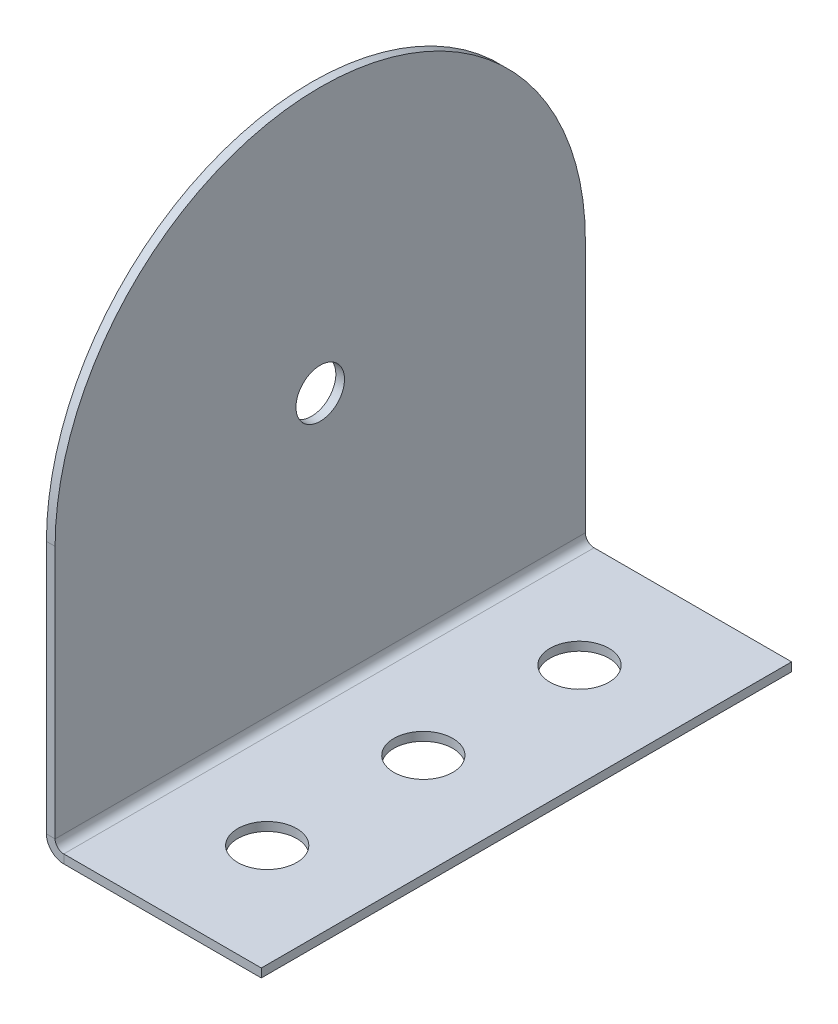
ISO-10303-21;
HEADER;
FILE_DESCRIPTION(('STEP AP214'),'2;1');
FILE_NAME('part.step','',(''),(''),'','','');
FILE_SCHEMA(('AUTOMOTIVE_DESIGN { 1 0 10303 214 1 1 1 1 }'));
ENDSEC;
DATA;
#1=APPLICATION_CONTEXT('core data for automotive mechanical design processes');
#2=APPLICATION_PROTOCOL_DEFINITION('international standard','automotive_design',2000,#1);
#3=PRODUCT_CONTEXT('',#1,'mechanical');
#4=PRODUCT('Part','Part','',(#3));
#5=PRODUCT_RELATED_PRODUCT_CATEGORY('part','',(#4));
#6=PRODUCT_DEFINITION_FORMATION('','',#4);
#7=PRODUCT_DEFINITION_CONTEXT('part definition',#1,'design');
#8=PRODUCT_DEFINITION('design','',#6,#7);
#9=PRODUCT_DEFINITION_SHAPE('','',#8);
#10=(LENGTH_UNIT() NAMED_UNIT(*) SI_UNIT(.MILLI.,.METRE.));
#11=(NAMED_UNIT(*) PLANE_ANGLE_UNIT() SI_UNIT($,.RADIAN.));
#12=(NAMED_UNIT(*) SI_UNIT($,.STERADIAN.) SOLID_ANGLE_UNIT());
#13=UNCERTAINTY_MEASURE_WITH_UNIT(LENGTH_MEASURE(1.E-05),#10,'distance_accuracy_value','');
#14=(GEOMETRIC_REPRESENTATION_CONTEXT(3) GLOBAL_UNCERTAINTY_ASSIGNED_CONTEXT((#13)) GLOBAL_UNIT_ASSIGNED_CONTEXT((#10,
#11,#12)) REPRESENTATION_CONTEXT('',''));
#15=CARTESIAN_POINT('',(0.,0.,0.));
#16=DIRECTION('',(0.,0.,1.));
#17=DIRECTION('',(1.,0.,0.));
#18=AXIS2_PLACEMENT_3D('',#15,#16,#17);
#19=CARTESIAN_POINT('',(1.76340000000008,22.2376271385243,22.5));
#20=DIRECTION('',(0.,0.,1.));
#21=DIRECTION('',(0.,-1.,0.));
#22=AXIS2_PLACEMENT_3D('',#19,#20,#21);
#23=PLANE('',#22);
#24=DIRECTION('',(0.,-1.,0.));
#25=VECTOR('',#24,1.);
#26=CARTESIAN_POINT('',(1.76340000000008,22.2376271385243,22.5));
#27=LINE('',#26,#25);
#28=CARTESIAN_POINT('',(1.76340000000008,22.2376271385243,22.5));
#29=VERTEX_POINT('',#28);
#30=CARTESIAN_POINT('',(1.7634,0.736600000000005,22.5));
#31=VERTEX_POINT('',#30);
#32=EDGE_CURVE('E101',#29,#31,#27,.T.);
#33=ORIENTED_EDGE('',*,*,#32,.T.);
#34=DIRECTION('',(1.,0.,0.));
#35=VECTOR('',#34,1.);
#36=CARTESIAN_POINT('',(1.7634,0.736600000000005,22.5));
#37=LINE('',#36,#35);
#38=CARTESIAN_POINT('',(2.5,0.736600000000004,22.5));
#39=VERTEX_POINT('',#38);
#40=EDGE_CURVE('E12',#31,#39,#37,.T.);
#41=ORIENTED_EDGE('',*,*,#40,.T.);
#42=DIRECTION('',(0.,-1.,0.));
#43=VECTOR('',#42,1.);
#44=CARTESIAN_POINT('',(2.50000000000008,22.2376271385243,22.5));
#45=LINE('',#44,#43);
#46=CARTESIAN_POINT('',(2.50000000000008,22.2376271385243,22.5));
#47=VERTEX_POINT('',#46);
#48=EDGE_CURVE('E94',#47,#39,#45,.T.);
#49=ORIENTED_EDGE('',*,*,#48,.F.);
#50=DIRECTION('',(1.,0.,0.));
#51=VECTOR('',#50,1.);
#52=CARTESIAN_POINT('',(1.76340000000008,22.2376271385243,22.5));
#53=LINE('',#52,#51);
#54=EDGE_CURVE('E66',#29,#47,#53,.T.);
#55=ORIENTED_EDGE('',*,*,#54,.F.);
#56=EDGE_LOOP('',(#33,#41,#49,#55));
#57=FACE_BOUND('',#56,.T.);
#58=ADVANCED_FACE('F41',(#57),#23,.T.);
#59=CARTESIAN_POINT('',(1.76340000000007,22.2376271385243,-22.5));
#60=DIRECTION('',(0.,0.,-1.));
#61=DIRECTION('',(0.,1.,0.));
#62=AXIS2_PLACEMENT_3D('',#59,#60,#61);
#63=PLANE('',#62);
#64=DIRECTION('',(0.,1.,0.));
#65=VECTOR('',#64,1.);
#66=CARTESIAN_POINT('',(2.50000000000007,22.2376271385243,-22.5));
#67=LINE('',#66,#65);
#68=CARTESIAN_POINT('',(2.5,0.736600000000004,-22.4999999999999));
#69=VERTEX_POINT('',#68);
#70=CARTESIAN_POINT('',(2.50000000000007,22.2376271385243,-22.5));
#71=VERTEX_POINT('',#70);
#72=EDGE_CURVE('E96',#69,#71,#67,.T.);
#73=ORIENTED_EDGE('',*,*,#72,.F.);
#74=DIRECTION('',(-1.,0.,0.));
#75=VECTOR('',#74,1.);
#76=CARTESIAN_POINT('',(1.7634,0.736600000000005,-22.5));
#77=LINE('',#76,#75);
#78=CARTESIAN_POINT('',(1.7634,0.736600000000008,-22.5));
#79=VERTEX_POINT('',#78);
#80=EDGE_CURVE('E119',#69,#79,#77,.T.);
#81=ORIENTED_EDGE('',*,*,#80,.T.);
#82=DIRECTION('',(0.,1.,0.));
#83=VECTOR('',#82,1.);
#84=CARTESIAN_POINT('',(1.76340000000007,22.2376271385243,-22.5));
#85=LINE('',#84,#83);
#86=CARTESIAN_POINT('',(1.76340000000007,22.2376271385243,-22.5));
#87=VERTEX_POINT('',#86);
#88=EDGE_CURVE('E44',#79,#87,#85,.T.);
#89=ORIENTED_EDGE('',*,*,#88,.T.);
#90=DIRECTION('',(1.,0.,0.));
#91=VECTOR('',#90,1.);
#92=CARTESIAN_POINT('',(1.76340000000007,22.2376271385243,-22.5));
#93=LINE('',#92,#91);
#94=EDGE_CURVE('E86',#87,#71,#93,.T.);
#95=ORIENTED_EDGE('',*,*,#94,.T.);
#96=EDGE_LOOP('',(#73,#81,#89,#95));
#97=FACE_BOUND('',#96,.T.);
#98=ADVANCED_FACE('F234',(#97),#63,.T.);
#99=CARTESIAN_POINT('',(1.76340000000008,22.2376271385243,0.));
#100=DIRECTION('',(-1.,0.,0.));
#101=DIRECTION('',(0.,0.,-1.));
#102=AXIS2_PLACEMENT_3D('',#99,#100,#101);
#103=PLANE('',#102);
#104=CARTESIAN_POINT('',(1.76340000000008,22.2376271385243,0.));
#105=DIRECTION('',(1.,0.,0.));
#106=DIRECTION('',(0.,0.,1.));
#107=AXIS2_PLACEMENT_3D('',#104,#105,#106);
#108=CIRCLE('',#107,2.06);
#109=CARTESIAN_POINT('',(1.76340000000008,22.2376271385243,2.06));
#110=VERTEX_POINT('',#109);
#111=EDGE_CURVE('E102',#110,#110,#108,.T.);
#112=ORIENTED_EDGE('',*,*,#111,.T.);
#113=EDGE_LOOP('',(#112));
#114=FACE_BOUND('',#113,.T.);
#115=ORIENTED_EDGE('',*,*,#88,.F.);
#116=DIRECTION('',(0.,0.,1.));
#117=VECTOR('',#116,1.);
#118=CARTESIAN_POINT('',(1.7634,0.736600000000005,0.));
#119=LINE('',#118,#117);
#120=EDGE_CURVE('E85',#79,#31,#119,.T.);
#121=ORIENTED_EDGE('',*,*,#120,.T.);
#122=ORIENTED_EDGE('',*,*,#32,.F.);
#123=CARTESIAN_POINT('',(1.76340000000008,22.2376271385243,0.));
#124=DIRECTION('',(1.,0.,0.));
#125=DIRECTION('',(0.,0.,-1.));
#126=AXIS2_PLACEMENT_3D('',#123,#124,#125);
#127=CIRCLE('',#126,22.5);
#128=EDGE_CURVE('E83',#87,#29,#127,.T.);
#129=ORIENTED_EDGE('',*,*,#128,.F.);
#130=EDGE_LOOP('',(#115,#121,#122,#129));
#131=FACE_BOUND('',#130,.T.);
#132=ADVANCED_FACE('F232',(#114,#131),#103,.T.);
#133=CARTESIAN_POINT('',(1.76340000000008,22.2376271385243,0.));
#134=DIRECTION('',(1.,0.,0.));
#135=DIRECTION('',(0.,0.,1.));
#136=AXIS2_PLACEMENT_3D('',#133,#134,#135);
#137=CYLINDRICAL_SURFACE('',#136,22.5);
#138=CARTESIAN_POINT('',(2.50000000000008,22.2376271385243,0.));
#139=DIRECTION('',(1.,0.,0.));
#140=DIRECTION('',(0.,0.,-1.));
#141=AXIS2_PLACEMENT_3D('',#138,#139,#140);
#142=CIRCLE('',#141,22.5);
#143=EDGE_CURVE('E81',#71,#47,#142,.T.);
#144=ORIENTED_EDGE('',*,*,#143,.F.);
#145=ORIENTED_EDGE('',*,*,#94,.F.);
#146=ORIENTED_EDGE('',*,*,#128,.T.);
#147=ORIENTED_EDGE('',*,*,#54,.T.);
#148=EDGE_LOOP('',(#144,#145,#146,#147));
#149=FACE_BOUND('',#148,.T.);
#150=ADVANCED_FACE('F79',(#149),#137,.T.);
#151=CARTESIAN_POINT('',(2.50000000000008,22.2376271385243,0.));
#152=DIRECTION('',(-1.,0.,0.));
#153=DIRECTION('',(0.,0.,-1.));
#154=AXIS2_PLACEMENT_3D('',#151,#152,#153);
#155=PLANE('',#154);
#156=DIRECTION('',(0.,0.,1.));
#157=VECTOR('',#156,1.);
#158=CARTESIAN_POINT('',(2.5,0.736600000000003,0.));
#159=LINE('',#158,#157);
#160=EDGE_CURVE('E49',#69,#39,#159,.T.);
#161=ORIENTED_EDGE('',*,*,#160,.F.);
#162=ORIENTED_EDGE('',*,*,#72,.T.);
#163=ORIENTED_EDGE('',*,*,#143,.T.);
#164=ORIENTED_EDGE('',*,*,#48,.T.);
#165=EDGE_LOOP('',(#161,#162,#163,#164));
#166=FACE_BOUND('',#165,.T.);
#167=CARTESIAN_POINT('',(2.50000000000008,22.2376271385243,0.));
#168=DIRECTION('',(1.,0.,0.));
#169=DIRECTION('',(0.,0.,1.));
#170=AXIS2_PLACEMENT_3D('',#167,#168,#169);
#171=CIRCLE('',#170,2.06);
#172=CARTESIAN_POINT('',(2.50000000000008,22.2376271385243,2.06));
#173=VERTEX_POINT('',#172);
#174=EDGE_CURVE('E104',#173,#173,#171,.T.);
#175=ORIENTED_EDGE('',*,*,#174,.F.);
#176=EDGE_LOOP('',(#175));
#177=FACE_BOUND('',#176,.T.);
#178=ADVANCED_FACE('F91',(#166,#177),#155,.F.);
#179=CARTESIAN_POINT('',(1.76340000000008,22.2376271385243,0.));
#180=DIRECTION('',(1.,0.,0.));
#181=DIRECTION('',(0.,0.,1.));
#182=AXIS2_PLACEMENT_3D('',#179,#180,#181);
#183=CYLINDRICAL_SURFACE('',#182,2.06);
#184=ORIENTED_EDGE('',*,*,#111,.F.);
#185=EDGE_LOOP('',(#184));
#186=FACE_BOUND('',#185,.T.);
#187=ORIENTED_EDGE('',*,*,#174,.T.);
#188=EDGE_LOOP('',(#187));
#189=FACE_BOUND('',#188,.T.);
#190=ADVANCED_FACE('F244',(#186,#189),#183,.F.);
#191=CARTESIAN_POINT('',(11.25,-0.7366,13.25));
#192=DIRECTION('',(0.,1.,0.));
#193=DIRECTION('',(0.,0.,1.));
#194=AXIS2_PLACEMENT_3D('',#191,#192,#193);
#195=CYLINDRICAL_SURFACE('',#194,2.5);
#196=CARTESIAN_POINT('',(11.25,-0.7366,13.25));
#197=DIRECTION('',(0.,1.,0.));
#198=DIRECTION('',(0.,0.,1.));
#199=AXIS2_PLACEMENT_3D('',#196,#197,#198);
#200=CIRCLE('',#199,2.5);
#201=CARTESIAN_POINT('',(11.25,-0.7366,15.75));
#202=VERTEX_POINT('',#201);
#203=EDGE_CURVE('E167',#202,#202,#200,.T.);
#204=ORIENTED_EDGE('',*,*,#203,.F.);
#205=EDGE_LOOP('',(#204));
#206=FACE_BOUND('',#205,.T.);
#207=CARTESIAN_POINT('',(11.25,0.,13.25));
#208=DIRECTION('',(0.,1.,0.));
#209=DIRECTION('',(0.,0.,1.));
#210=AXIS2_PLACEMENT_3D('',#207,#208,#209);
#211=CIRCLE('',#210,2.5);
#212=CARTESIAN_POINT('',(11.25,0.,15.75));
#213=VERTEX_POINT('',#212);
#214=EDGE_CURVE('E188',#213,#213,#211,.T.);
#215=ORIENTED_EDGE('',*,*,#214,.T.);
#216=EDGE_LOOP('',(#215));
#217=FACE_BOUND('',#216,.T.);
#218=ADVANCED_FACE('F249',(#206,#217),#195,.F.);
#219=CARTESIAN_POINT('',(11.25,-0.7366,-13.25));
#220=DIRECTION('',(0.,1.,0.));
#221=DIRECTION('',(0.,0.,1.));
#222=AXIS2_PLACEMENT_3D('',#219,#220,#221);
#223=CYLINDRICAL_SURFACE('',#222,2.5);
#224=CARTESIAN_POINT('',(11.25,-0.7366,-13.25));
#225=DIRECTION('',(0.,1.,0.));
#226=DIRECTION('',(0.,0.,1.));
#227=AXIS2_PLACEMENT_3D('',#224,#225,#226);
#228=CIRCLE('',#227,2.5);
#229=CARTESIAN_POINT('',(11.25,-0.7366,-10.75));
#230=VERTEX_POINT('',#229);
#231=EDGE_CURVE('E170',#230,#230,#228,.T.);
#232=ORIENTED_EDGE('',*,*,#231,.F.);
#233=EDGE_LOOP('',(#232));
#234=FACE_BOUND('',#233,.T.);
#235=CARTESIAN_POINT('',(11.25,0.,-13.25));
#236=DIRECTION('',(0.,1.,0.));
#237=DIRECTION('',(0.,0.,1.));
#238=AXIS2_PLACEMENT_3D('',#235,#236,#237);
#239=CIRCLE('',#238,2.5);
#240=CARTESIAN_POINT('',(11.25,0.,-10.75));
#241=VERTEX_POINT('',#240);
#242=EDGE_CURVE('E185',#241,#241,#239,.T.);
#243=ORIENTED_EDGE('',*,*,#242,.T.);
#244=EDGE_LOOP('',(#243));
#245=FACE_BOUND('',#244,.T.);
#246=ADVANCED_FACE('F272',(#234,#245),#223,.F.);
#247=CARTESIAN_POINT('',(11.25,-0.7366,0.));
#248=DIRECTION('',(0.,1.,0.));
#249=DIRECTION('',(0.,0.,1.));
#250=AXIS2_PLACEMENT_3D('',#247,#248,#249);
#251=CYLINDRICAL_SURFACE('',#250,2.50000000000001);
#252=CARTESIAN_POINT('',(11.25,-0.7366,0.));
#253=DIRECTION('',(0.,1.,0.));
#254=DIRECTION('',(0.,0.,1.));
#255=AXIS2_PLACEMENT_3D('',#252,#253,#254);
#256=CIRCLE('',#255,2.50000000000001);
#257=CARTESIAN_POINT('',(11.25,-0.7366,2.50000000000001));
#258=VERTEX_POINT('',#257);
#259=EDGE_CURVE('E173',#258,#258,#256,.T.);
#260=ORIENTED_EDGE('',*,*,#259,.F.);
#261=EDGE_LOOP('',(#260));
#262=FACE_BOUND('',#261,.T.);
#263=CARTESIAN_POINT('',(11.25,0.,0.));
#264=DIRECTION('',(0.,1.,0.));
#265=DIRECTION('',(0.,0.,1.));
#266=AXIS2_PLACEMENT_3D('',#263,#264,#265);
#267=CIRCLE('',#266,2.50000000000001);
#268=CARTESIAN_POINT('',(11.25,0.,2.50000000000001));
#269=VERTEX_POINT('',#268);
#270=EDGE_CURVE('E182',#269,#269,#267,.T.);
#271=ORIENTED_EDGE('',*,*,#270,.T.);
#272=EDGE_LOOP('',(#271));
#273=FACE_BOUND('',#272,.T.);
#274=ADVANCED_FACE('F268',(#262,#273),#251,.F.);
#275=CARTESIAN_POINT('',(20.,-0.7366,-22.5));
#276=DIRECTION('',(1.,0.,0.));
#277=DIRECTION('',(0.,0.,-1.));
#278=AXIS2_PLACEMENT_3D('',#275,#276,#277);
#279=PLANE('',#278);
#280=DIRECTION('',(0.,0.,-1.));
#281=VECTOR('',#280,1.);
#282=CARTESIAN_POINT('',(20.,0.,-22.5));
#283=LINE('',#282,#281);
#284=CARTESIAN_POINT('',(20.,0.,22.5));
#285=VERTEX_POINT('',#284);
#286=CARTESIAN_POINT('',(20.,0.,-22.5));
#287=VERTEX_POINT('',#286);
#288=EDGE_CURVE('E152',#285,#287,#283,.T.);
#289=ORIENTED_EDGE('',*,*,#288,.F.);
#290=DIRECTION('',(0.,1.,0.));
#291=VECTOR('',#290,1.);
#292=CARTESIAN_POINT('',(20.,-0.7366,22.5));
#293=LINE('',#292,#291);
#294=CARTESIAN_POINT('',(20.,-0.7366,22.5));
#295=VERTEX_POINT('',#294);
#296=EDGE_CURVE('E109',#295,#285,#293,.T.);
#297=ORIENTED_EDGE('',*,*,#296,.F.);
#298=DIRECTION('',(0.,0.,-1.));
#299=VECTOR('',#298,1.);
#300=CARTESIAN_POINT('',(20.,-0.7366,-22.5));
#301=LINE('',#300,#299);
#302=CARTESIAN_POINT('',(20.,-0.7366,-22.5));
#303=VERTEX_POINT('',#302);
#304=EDGE_CURVE('E179',#295,#303,#301,.T.);
#305=ORIENTED_EDGE('',*,*,#304,.T.);
#306=DIRECTION('',(0.,1.,0.));
#307=VECTOR('',#306,1.);
#308=CARTESIAN_POINT('',(20.,-0.7366,-22.5));
#309=LINE('',#308,#307);
#310=EDGE_CURVE('E176',#303,#287,#309,.T.);
#311=ORIENTED_EDGE('',*,*,#310,.T.);
#312=EDGE_LOOP('',(#289,#297,#305,#311));
#313=FACE_BOUND('',#312,.T.);
#314=ADVANCED_FACE('F265',(#313),#279,.T.);
#315=CARTESIAN_POINT('',(-20.,-0.7366,0.));
#316=DIRECTION('',(0.,-1.,0.));
#317=DIRECTION('',(0.,0.,-1.));
#318=AXIS2_PLACEMENT_3D('',#315,#316,#317);
#319=PLANE('',#318);
#320=DIRECTION('',(0.,0.,1.));
#321=VECTOR('',#320,1.);
#322=CARTESIAN_POINT('',(3.2366,-0.7366,0.));
#323=LINE('',#322,#321);
#324=CARTESIAN_POINT('',(3.2366,-0.7366,-22.5));
#325=VERTEX_POINT('',#324);
#326=CARTESIAN_POINT('',(3.2366,-0.7366,22.5));
#327=VERTEX_POINT('',#326);
#328=EDGE_CURVE('E112',#325,#327,#323,.T.);
#329=ORIENTED_EDGE('',*,*,#328,.F.);
#330=DIRECTION('',(-1.,0.,0.));
#331=VECTOR('',#330,1.);
#332=CARTESIAN_POINT('',(-20.,-0.7366,-22.5));
#333=LINE('',#332,#331);
#334=EDGE_CURVE('E164',#303,#325,#333,.T.);
#335=ORIENTED_EDGE('',*,*,#334,.F.);
#336=ORIENTED_EDGE('',*,*,#304,.F.);
#337=DIRECTION('',(1.,0.,0.));
#338=VECTOR('',#337,1.);
#339=CARTESIAN_POINT('',(-20.,-0.7366,22.5));
#340=LINE('',#339,#338);
#341=EDGE_CURVE('E149',#327,#295,#340,.T.);
#342=ORIENTED_EDGE('',*,*,#341,.F.);
#343=EDGE_LOOP('',(#329,#335,#336,#342));
#344=FACE_BOUND('',#343,.T.);
#345=ORIENTED_EDGE('',*,*,#259,.T.);
#346=EDGE_LOOP('',(#345));
#347=FACE_BOUND('',#346,.T.);
#348=ORIENTED_EDGE('',*,*,#231,.T.);
#349=EDGE_LOOP('',(#348));
#350=FACE_BOUND('',#349,.T.);
#351=ORIENTED_EDGE('',*,*,#203,.T.);
#352=EDGE_LOOP('',(#351));
#353=FACE_BOUND('',#352,.T.);
#354=ADVANCED_FACE('F201',(#344,#347,#350,#353),#319,.T.);
#355=CARTESIAN_POINT('',(-20.,-0.7366,-22.5));
#356=DIRECTION('',(0.,0.,-1.));
#357=DIRECTION('',(-1.,0.,0.));
#358=AXIS2_PLACEMENT_3D('',#355,#356,#357);
#359=PLANE('',#358);
#360=DIRECTION('',(0.,-1.,0.));
#361=VECTOR('',#360,1.);
#362=CARTESIAN_POINT('',(3.2366,-0.7366,-22.5));
#363=LINE('',#362,#361);
#364=CARTESIAN_POINT('',(3.2366,0.,-22.5));
#365=VERTEX_POINT('',#364);
#366=EDGE_CURVE('E191',#365,#325,#363,.T.);
#367=ORIENTED_EDGE('',*,*,#366,.F.);
#368=DIRECTION('',(-1.,0.,0.));
#369=VECTOR('',#368,1.);
#370=CARTESIAN_POINT('',(-20.,0.,-22.5));
#371=LINE('',#370,#369);
#372=EDGE_CURVE('E161',#287,#365,#371,.T.);
#373=ORIENTED_EDGE('',*,*,#372,.F.);
#374=ORIENTED_EDGE('',*,*,#310,.F.);
#375=ORIENTED_EDGE('',*,*,#334,.T.);
#376=EDGE_LOOP('',(#367,#373,#374,#375));
#377=FACE_BOUND('',#376,.T.);
#378=ADVANCED_FACE('F215',(#377),#359,.T.);
#379=CARTESIAN_POINT('',(-20.,0.,0.));
#380=DIRECTION('',(0.,-1.,0.));
#381=DIRECTION('',(0.,0.,-1.));
#382=AXIS2_PLACEMENT_3D('',#379,#380,#381);
#383=PLANE('',#382);
#384=ORIENTED_EDGE('',*,*,#214,.F.);
#385=EDGE_LOOP('',(#384));
#386=FACE_BOUND('',#385,.T.);
#387=ORIENTED_EDGE('',*,*,#242,.F.);
#388=EDGE_LOOP('',(#387));
#389=FACE_BOUND('',#388,.T.);
#390=ORIENTED_EDGE('',*,*,#270,.F.);
#391=EDGE_LOOP('',(#390));
#392=FACE_BOUND('',#391,.T.);
#393=ORIENTED_EDGE('',*,*,#372,.T.);
#394=DIRECTION('',(0.,0.,1.));
#395=VECTOR('',#394,1.);
#396=CARTESIAN_POINT('',(3.2366,0.,0.));
#397=LINE('',#396,#395);
#398=CARTESIAN_POINT('',(3.2366,0.,22.5));
#399=VERTEX_POINT('',#398);
#400=EDGE_CURVE('E158',#365,#399,#397,.T.);
#401=ORIENTED_EDGE('',*,*,#400,.T.);
#402=DIRECTION('',(1.,0.,0.));
#403=VECTOR('',#402,1.);
#404=CARTESIAN_POINT('',(-20.,0.,22.5));
#405=LINE('',#404,#403);
#406=EDGE_CURVE('E155',#399,#285,#405,.T.);
#407=ORIENTED_EDGE('',*,*,#406,.T.);
#408=ORIENTED_EDGE('',*,*,#288,.T.);
#409=EDGE_LOOP('',(#393,#401,#407,#408));
#410=FACE_BOUND('',#409,.T.);
#411=ADVANCED_FACE('F220',(#386,#389,#392,#410),#383,.F.);
#412=CARTESIAN_POINT('',(-20.,-0.7366,22.5));
#413=DIRECTION('',(0.,0.,1.));
#414=DIRECTION('',(1.,0.,0.));
#415=AXIS2_PLACEMENT_3D('',#412,#413,#414);
#416=PLANE('',#415);
#417=DIRECTION('',(0.,1.,0.));
#418=VECTOR('',#417,1.);
#419=CARTESIAN_POINT('',(3.2366,-0.7366,22.5));
#420=LINE('',#419,#418);
#421=EDGE_CURVE('E139',#327,#399,#420,.T.);
#422=ORIENTED_EDGE('',*,*,#421,.F.);
#423=ORIENTED_EDGE('',*,*,#341,.T.);
#424=ORIENTED_EDGE('',*,*,#296,.T.);
#425=ORIENTED_EDGE('',*,*,#406,.F.);
#426=EDGE_LOOP('',(#422,#423,#424,#425));
#427=FACE_BOUND('',#426,.T.);
#428=ADVANCED_FACE('F255',(#427),#416,.T.);
#429=CARTESIAN_POINT('',(3.2366,0.7366,-22.5));
#430=DIRECTION('',(0.,0.,-1.));
#431=DIRECTION('',(-1.,0.,0.));
#432=AXIS2_PLACEMENT_3D('',#429,#430,#431);
#433=PLANE('',#432);
#434=ORIENTED_EDGE('',*,*,#80,.F.);
#435=CARTESIAN_POINT('',(3.2366,0.7366,-22.4999999999999));
#436=DIRECTION('',(0.,0.,-1.));
#437=DIRECTION('',(-1.,0.,0.));
#438=AXIS2_PLACEMENT_3D('',#435,#436,#437);
#439=CIRCLE('',#438,0.7366);
#440=EDGE_CURVE('E133',#69,#365,#439,.F.);
#441=ORIENTED_EDGE('',*,*,#440,.T.);
#442=ORIENTED_EDGE('',*,*,#366,.T.);
#443=CARTESIAN_POINT('',(3.2366,0.7366,-22.5));
#444=DIRECTION('',(0.,0.,1.));
#445=DIRECTION('',(-1.,0.,0.));
#446=AXIS2_PLACEMENT_3D('',#443,#444,#445);
#447=CIRCLE('',#446,1.4732);
#448=EDGE_CURVE('E140',#79,#325,#447,.T.);
#449=ORIENTED_EDGE('',*,*,#448,.F.);
#450=EDGE_LOOP('',(#434,#441,#442,#449));
#451=FACE_BOUND('',#450,.T.);
#452=ADVANCED_FACE('F210',(#451),#433,.T.);
#453=CARTESIAN_POINT('',(3.2366,0.7366,22.5));
#454=DIRECTION('',(0.,0.,1.));
#455=DIRECTION('',(1.,0.,0.));
#456=AXIS2_PLACEMENT_3D('',#453,#454,#455);
#457=PLANE('',#456);
#458=CARTESIAN_POINT('',(3.2366,0.7366,22.5));
#459=DIRECTION('',(0.,0.,-1.));
#460=DIRECTION('',(-1.,0.,0.));
#461=AXIS2_PLACEMENT_3D('',#458,#459,#460);
#462=CIRCLE('',#461,0.7366);
#463=EDGE_CURVE('E130',#399,#39,#462,.T.);
#464=ORIENTED_EDGE('',*,*,#463,.T.);
#465=ORIENTED_EDGE('',*,*,#40,.F.);
#466=CARTESIAN_POINT('',(3.2366,0.7366,22.5));
#467=DIRECTION('',(0.,0.,-1.));
#468=DIRECTION('',(1.,0.,0.));
#469=AXIS2_PLACEMENT_3D('',#466,#467,#468);
#470=CIRCLE('',#469,1.4732);
#471=EDGE_CURVE('E57',#327,#31,#470,.T.);
#472=ORIENTED_EDGE('',*,*,#471,.F.);
#473=ORIENTED_EDGE('',*,*,#421,.T.);
#474=EDGE_LOOP('',(#464,#465,#472,#473));
#475=FACE_BOUND('',#474,.T.);
#476=ADVANCED_FACE('F137',(#475),#457,.T.);
#477=CARTESIAN_POINT('',(3.23660000000001,0.7366,45.0394803779694));
#478=DIRECTION('',(0.,0.,-1.));
#479=DIRECTION('',(-1.,0.,0.));
#480=AXIS2_PLACEMENT_3D('',#477,#478,#479);
#481=CYLINDRICAL_SURFACE('',#480,1.4732);
#482=ORIENTED_EDGE('',*,*,#328,.T.);
#483=ORIENTED_EDGE('',*,*,#471,.T.);
#484=ORIENTED_EDGE('',*,*,#120,.F.);
#485=ORIENTED_EDGE('',*,*,#448,.T.);
#486=EDGE_LOOP('',(#482,#483,#484,#485));
#487=FACE_BOUND('',#486,.T.);
#488=ADVANCED_FACE('F195',(#487),#481,.T.);
#489=CARTESIAN_POINT('',(3.23660000000001,0.7366,45.0394803779694));
#490=DIRECTION('',(0.,0.,-1.));
#491=DIRECTION('',(-1.,0.,0.));
#492=AXIS2_PLACEMENT_3D('',#489,#490,#491);
#493=CYLINDRICAL_SURFACE('',#492,0.7366);
#494=ORIENTED_EDGE('',*,*,#400,.F.);
#495=ORIENTED_EDGE('',*,*,#440,.F.);
#496=ORIENTED_EDGE('',*,*,#160,.T.);
#497=ORIENTED_EDGE('',*,*,#463,.F.);
#498=EDGE_LOOP('',(#494,#495,#496,#497));
#499=FACE_BOUND('',#498,.T.);
#500=ADVANCED_FACE('F128',(#499),#493,.F.);
#501=CLOSED_SHELL('',(#58,#98,#132,#150,#178,#190,#218,#246,#274,#314,#354,#378,#411,#428,#452,
#476,#488,#500));
#502=MANIFOLD_SOLID_BREP('B2',#501);
#503=ADVANCED_BREP_SHAPE_REPRESENTATION('',(#18,#502),#14);
#504=SHAPE_DEFINITION_REPRESENTATION(#9,#503);
ENDSEC;
END-ISO-10303-21;
